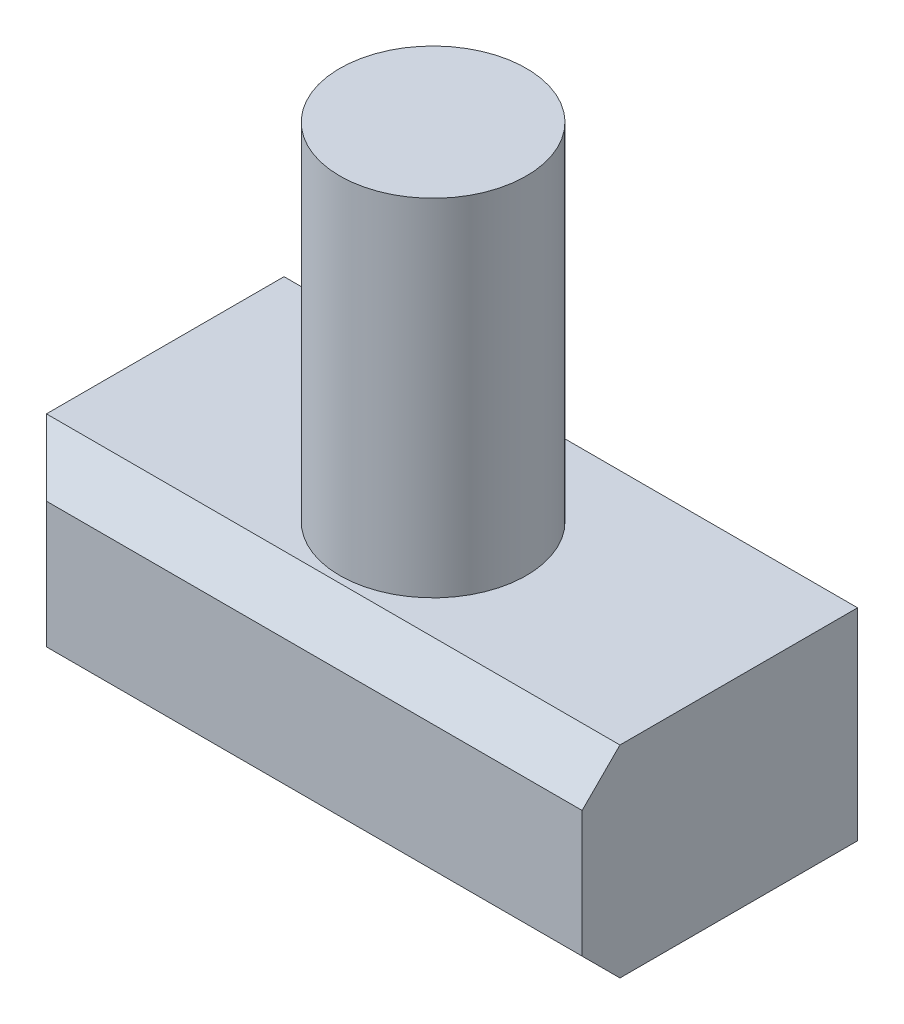
ISO-10303-21;
HEADER;
FILE_DESCRIPTION(('STEP AP214'),'2;1');
FILE_NAME('part.step','',(''),(''),'','','');
FILE_SCHEMA(('AUTOMOTIVE_DESIGN { 1 0 10303 214 1 1 1 1 }'));
ENDSEC;
DATA;
#1=APPLICATION_CONTEXT('core data for automotive mechanical design processes');
#2=APPLICATION_PROTOCOL_DEFINITION('international standard','automotive_design',2000,#1);
#3=PRODUCT_CONTEXT('',#1,'mechanical');
#4=PRODUCT('Part','Part','',(#3));
#5=PRODUCT_RELATED_PRODUCT_CATEGORY('part','',(#4));
#6=PRODUCT_DEFINITION_FORMATION('','',#4);
#7=PRODUCT_DEFINITION_CONTEXT('part definition',#1,'design');
#8=PRODUCT_DEFINITION('design','',#6,#7);
#9=PRODUCT_DEFINITION_SHAPE('','',#8);
#10=(LENGTH_UNIT() NAMED_UNIT(*) SI_UNIT(.MILLI.,.METRE.));
#11=(NAMED_UNIT(*) PLANE_ANGLE_UNIT() SI_UNIT($,.RADIAN.));
#12=(NAMED_UNIT(*) SI_UNIT($,.STERADIAN.) SOLID_ANGLE_UNIT());
#13=UNCERTAINTY_MEASURE_WITH_UNIT(LENGTH_MEASURE(1.E-05),#10,'distance_accuracy_value','');
#14=(GEOMETRIC_REPRESENTATION_CONTEXT(3) GLOBAL_UNCERTAINTY_ASSIGNED_CONTEXT((#13)) GLOBAL_UNIT_ASSIGNED_CONTEXT((#10,
#11,#12)) REPRESENTATION_CONTEXT('',''));
#15=CARTESIAN_POINT('',(0.,0.,0.));
#16=DIRECTION('',(0.,0.,1.));
#17=DIRECTION('',(1.,0.,0.));
#18=AXIS2_PLACEMENT_3D('',#15,#16,#17);
#19=CARTESIAN_POINT('',(122.714640909491,86.36,-58.9328670629167));
#20=DIRECTION('',(-1.,0.,0.));
#21=DIRECTION('',(0.,0.,1.));
#22=AXIS2_PLACEMENT_3D('',#19,#20,#21);
#23=PLANE('',#22);
#24=DIRECTION('',(0.,0.,-1.));
#25=VECTOR('',#24,1.);
#26=CARTESIAN_POINT('',(122.714640909491,86.36,-58.9328670629167));
#27=LINE('',#26,#25);
#28=CARTESIAN_POINT('',(122.714640909491,86.36,42.7528664029167));
#29=VERTEX_POINT('',#28);
#30=CARTESIAN_POINT('',(122.714640909491,86.36,-58.9328670629167));
#31=VERTEX_POINT('',#30);
#32=EDGE_CURVE('E93',#29,#31,#27,.T.);
#33=ORIENTED_EDGE('',*,*,#32,.F.);
#34=DIRECTION('',(0.,-0.707106781186546,0.707106781186549));
#35=VECTOR('',#34,1.);
#36=CARTESIAN_POINT('',(122.714640909491,86.36,42.7528664029167));
#37=LINE('',#36,#35);
#38=CARTESIAN_POINT('',(122.714640909491,70.17999934,58.9328670629167));
#39=VERTEX_POINT('',#38);
#40=EDGE_CURVE('E124',#29,#39,#37,.T.);
#41=ORIENTED_EDGE('',*,*,#40,.T.);
#42=DIRECTION('',(0.,-1.,0.));
#43=VECTOR('',#42,1.);
#44=CARTESIAN_POINT('',(122.714640909491,86.36,58.9328670629167));
#45=LINE('',#44,#43);
#46=CARTESIAN_POINT('',(122.714640909491,16.18000066,58.9328670629167));
#47=VERTEX_POINT('',#46);
#48=EDGE_CURVE('E119',#39,#47,#45,.T.);
#49=ORIENTED_EDGE('',*,*,#48,.T.);
#50=DIRECTION('',(0.,0.707106781186546,0.707106781186549));
#51=VECTOR('',#50,1.);
#52=CARTESIAN_POINT('',(122.714640909491,16.18000066,58.9328670629167));
#53=LINE('',#52,#51);
#54=CARTESIAN_POINT('',(122.714640909491,0.,42.7528664029167));
#55=VERTEX_POINT('',#54);
#56=EDGE_CURVE('E117',#47,#55,#53,.F.);
#57=ORIENTED_EDGE('',*,*,#56,.T.);
#58=DIRECTION('',(0.,0.,-1.));
#59=VECTOR('',#58,1.);
#60=CARTESIAN_POINT('',(122.714640909491,0.,-58.9328670629167));
#61=LINE('',#60,#59);
#62=CARTESIAN_POINT('',(122.714640909491,0.,-58.9328670629167));
#63=VERTEX_POINT('',#62);
#64=EDGE_CURVE('E114',#55,#63,#61,.T.);
#65=ORIENTED_EDGE('',*,*,#64,.T.);
#66=DIRECTION('',(0.,-1.,0.));
#67=VECTOR('',#66,1.);
#68=CARTESIAN_POINT('',(122.714640909491,86.36,-58.9328670629167));
#69=LINE('',#68,#67);
#70=EDGE_CURVE('E108',#31,#63,#69,.T.);
#71=ORIENTED_EDGE('',*,*,#70,.F.);
#72=EDGE_LOOP('',(#33,#41,#49,#57,#65,#71));
#73=FACE_BOUND('',#72,.T.);
#74=ADVANCED_FACE('F35',(#73),#23,.F.);
#75=CARTESIAN_POINT('',(-122.714640909491,86.36,-58.9328670629167));
#76=DIRECTION('',(0.,0.,1.));
#77=DIRECTION('',(1.,0.,0.));
#78=AXIS2_PLACEMENT_3D('',#75,#76,#77);
#79=PLANE('',#78);
#80=DIRECTION('',(-1.,0.,0.));
#81=VECTOR('',#80,1.);
#82=CARTESIAN_POINT('',(-122.714640909491,0.,-58.9328670629167));
#83=LINE('',#82,#81);
#84=CARTESIAN_POINT('',(-122.714640909491,0.,-58.9328670629167));
#85=VERTEX_POINT('',#84);
#86=EDGE_CURVE('E146',#63,#85,#83,.T.);
#87=ORIENTED_EDGE('',*,*,#86,.T.);
#88=DIRECTION('',(0.,-1.,0.));
#89=VECTOR('',#88,1.);
#90=CARTESIAN_POINT('',(-122.714640909491,86.36,-58.9328670629167));
#91=LINE('',#90,#89);
#92=CARTESIAN_POINT('',(-122.714640909491,86.36,-58.9328670629167));
#93=VERTEX_POINT('',#92);
#94=EDGE_CURVE('E110',#93,#85,#91,.T.);
#95=ORIENTED_EDGE('',*,*,#94,.F.);
#96=DIRECTION('',(-1.,0.,0.));
#97=VECTOR('',#96,1.);
#98=CARTESIAN_POINT('',(-122.714640909491,86.36,-58.9328670629167));
#99=LINE('',#98,#97);
#100=EDGE_CURVE('E97',#31,#93,#99,.T.);
#101=ORIENTED_EDGE('',*,*,#100,.F.);
#102=ORIENTED_EDGE('',*,*,#70,.T.);
#103=EDGE_LOOP('',(#87,#95,#101,#102));
#104=FACE_BOUND('',#103,.T.);
#105=ADVANCED_FACE('F107',(#104),#79,.F.);
#106=CARTESIAN_POINT('',(-122.714640909491,86.36,-58.9328670629167));
#107=DIRECTION('',(1.,0.,0.));
#108=DIRECTION('',(0.,0.,-1.));
#109=AXIS2_PLACEMENT_3D('',#106,#107,#108);
#110=PLANE('',#109);
#111=DIRECTION('',(0.,0.,1.));
#112=VECTOR('',#111,1.);
#113=CARTESIAN_POINT('',(-122.714640909491,0.,-58.9328670629167));
#114=LINE('',#113,#112);
#115=CARTESIAN_POINT('',(-122.714640909491,0.,42.7528664029167));
#116=VERTEX_POINT('',#115);
#117=EDGE_CURVE('E103',#85,#116,#114,.T.);
#118=ORIENTED_EDGE('',*,*,#117,.T.);
#119=DIRECTION('',(0.,1.,0.));
#120=VECTOR('',#119,1.);
#121=CARTESIAN_POINT('',(-122.714640909491,86.36,42.7528664029167));
#122=LINE('',#121,#120);
#123=CARTESIAN_POINT('',(-122.714640909491,86.36,42.7528664029167));
#124=VERTEX_POINT('',#123);
#125=EDGE_CURVE('E131',#116,#124,#122,.T.);
#126=ORIENTED_EDGE('',*,*,#125,.T.);
#127=DIRECTION('',(0.,0.,1.));
#128=VECTOR('',#127,1.);
#129=CARTESIAN_POINT('',(-122.714640909491,86.36,-58.9328670629167));
#130=LINE('',#129,#128);
#131=EDGE_CURVE('E112',#93,#124,#130,.T.);
#132=ORIENTED_EDGE('',*,*,#131,.F.);
#133=ORIENTED_EDGE('',*,*,#94,.T.);
#134=EDGE_LOOP('',(#118,#126,#132,#133));
#135=FACE_BOUND('',#134,.T.);
#136=ADVANCED_FACE('F157',(#135),#110,.F.);
#137=CARTESIAN_POINT('',(-122.714640909491,86.36,58.9328670629167));
#138=DIRECTION('',(0.,0.,-1.));
#139=DIRECTION('',(-1.,0.,0.));
#140=AXIS2_PLACEMENT_3D('',#137,#138,#139);
#141=PLANE('',#140);
#142=ORIENTED_EDGE('',*,*,#48,.F.);
#143=DIRECTION('',(-1.,0.,0.));
#144=VECTOR('',#143,1.);
#145=CARTESIAN_POINT('',(-122.714640909491,70.17999934,58.9328670629167));
#146=LINE('',#145,#144);
#147=CARTESIAN_POINT('',(-106.534640249491,70.17999934,58.9328670629167));
#148=VERTEX_POINT('',#147);
#149=EDGE_CURVE('E60',#39,#148,#146,.T.);
#150=ORIENTED_EDGE('',*,*,#149,.T.);
#151=DIRECTION('',(0.,-1.,0.));
#152=VECTOR('',#151,1.);
#153=CARTESIAN_POINT('',(-106.534640249491,86.36,58.9328670629167));
#154=LINE('',#153,#152);
#155=CARTESIAN_POINT('',(-106.534640249491,16.18000066,58.9328670629167));
#156=VERTEX_POINT('',#155);
#157=EDGE_CURVE('E128',#148,#156,#154,.T.);
#158=ORIENTED_EDGE('',*,*,#157,.T.);
#159=DIRECTION('',(1.,0.,0.));
#160=VECTOR('',#159,1.);
#161=CARTESIAN_POINT('',(-122.714640909491,16.18000066,58.9328670629167));
#162=LINE('',#161,#160);
#163=EDGE_CURVE('E126',#156,#47,#162,.T.);
#164=ORIENTED_EDGE('',*,*,#163,.T.);
#165=EDGE_LOOP('',(#142,#150,#158,#164));
#166=FACE_BOUND('',#165,.T.);
#167=ADVANCED_FACE('F165',(#166),#141,.F.);
#168=CARTESIAN_POINT('',(0.,86.36,0.));
#169=DIRECTION('',(0.,1.,0.));
#170=DIRECTION('',(0.,0.,1.));
#171=AXIS2_PLACEMENT_3D('',#168,#169,#170);
#172=PLANE('',#171);
#173=CARTESIAN_POINT('',(0.,86.36,0.));
#174=DIRECTION('',(0.,1.,0.));
#175=DIRECTION('',(0.,0.,1.));
#176=AXIS2_PLACEMENT_3D('',#173,#174,#175);
#177=CIRCLE('',#176,39.9157816817868);
#178=CARTESIAN_POINT('',(0.,86.36,39.9157816817868));
#179=VERTEX_POINT('',#178);
#180=EDGE_CURVE('E11',#179,#179,#177,.T.);
#181=ORIENTED_EDGE('',*,*,#180,.F.);
#182=EDGE_LOOP('',(#181));
#183=FACE_BOUND('',#182,.T.);
#184=ORIENTED_EDGE('',*,*,#131,.T.);
#185=DIRECTION('',(1.,0.,0.));
#186=VECTOR('',#185,1.);
#187=CARTESIAN_POINT('',(122.714640909491,86.36,42.7528664029167));
#188=LINE('',#187,#186);
#189=EDGE_CURVE('E100',#124,#29,#188,.T.);
#190=ORIENTED_EDGE('',*,*,#189,.T.);
#191=ORIENTED_EDGE('',*,*,#32,.T.);
#192=ORIENTED_EDGE('',*,*,#100,.T.);
#193=EDGE_LOOP('',(#184,#190,#191,#192));
#194=FACE_BOUND('',#193,.T.);
#195=ADVANCED_FACE('F96',(#183,#194),#172,.T.);
#196=CARTESIAN_POINT('',(0.,0.,0.));
#197=DIRECTION('',(0.,1.,0.));
#198=DIRECTION('',(0.,0.,1.));
#199=AXIS2_PLACEMENT_3D('',#196,#197,#198);
#200=PLANE('',#199);
#201=ORIENTED_EDGE('',*,*,#64,.F.);
#202=DIRECTION('',(-1.,0.,0.));
#203=VECTOR('',#202,1.);
#204=CARTESIAN_POINT('',(0.,0.,42.7528664029167));
#205=LINE('',#204,#203);
#206=EDGE_CURVE('E45',#55,#116,#205,.T.);
#207=ORIENTED_EDGE('',*,*,#206,.T.);
#208=ORIENTED_EDGE('',*,*,#117,.F.);
#209=ORIENTED_EDGE('',*,*,#86,.F.);
#210=EDGE_LOOP('',(#201,#207,#208,#209));
#211=FACE_BOUND('',#210,.T.);
#212=ADVANCED_FACE('F158',(#211),#200,.F.);
#213=CARTESIAN_POINT('',(-122.714640909491,16.18000066,58.9328670629167));
#214=DIRECTION('',(0.,0.707106781186549,-0.707106781186546));
#215=DIRECTION('',(1.,0.,0.));
#216=AXIS2_PLACEMENT_3D('',#213,#214,#215);
#217=PLANE('',#216);
#218=ORIENTED_EDGE('',*,*,#56,.F.);
#219=ORIENTED_EDGE('',*,*,#163,.F.);
#220=DIRECTION('',(-0.577350269189625,-0.577350269189625,-0.577350269189628));
#221=VECTOR('',#220,1.);
#222=CARTESIAN_POINT('',(-111.927973802825,10.7866671066667,53.5395335095834));
#223=LINE('',#222,#221);
#224=EDGE_CURVE('E40',#116,#156,#223,.F.);
#225=ORIENTED_EDGE('',*,*,#224,.F.);
#226=ORIENTED_EDGE('',*,*,#206,.F.);
#227=EDGE_LOOP('',(#218,#219,#225,#226));
#228=FACE_BOUND('',#227,.T.);
#229=ADVANCED_FACE('F38',(#228),#217,.F.);
#230=CARTESIAN_POINT('',(-106.534640249491,86.36,58.9328670629167));
#231=DIRECTION('',(0.707106781186549,0.,-0.707106781186546));
#232=DIRECTION('',(0.,-1.,0.));
#233=AXIS2_PLACEMENT_3D('',#230,#231,#232);
#234=PLANE('',#233);
#235=ORIENTED_EDGE('',*,*,#224,.T.);
#236=ORIENTED_EDGE('',*,*,#157,.F.);
#237=DIRECTION('',(0.577350269189625,-0.577350269189625,0.577350269189628));
#238=VECTOR('',#237,1.);
#239=CARTESIAN_POINT('',(-111.927973802825,75.5733328933333,53.5395335095834));
#240=LINE('',#239,#238);
#241=EDGE_CURVE('E133',#124,#148,#240,.T.);
#242=ORIENTED_EDGE('',*,*,#241,.F.);
#243=ORIENTED_EDGE('',*,*,#125,.F.);
#244=EDGE_LOOP('',(#235,#236,#242,#243));
#245=FACE_BOUND('',#244,.T.);
#246=ADVANCED_FACE('F155',(#245),#234,.F.);
#247=CARTESIAN_POINT('',(0.,86.36,42.7528664029167));
#248=DIRECTION('',(0.,0.707106781186549,0.707106781186546));
#249=DIRECTION('',(-1.,0.,0.));
#250=AXIS2_PLACEMENT_3D('',#247,#248,#249);
#251=PLANE('',#250);
#252=ORIENTED_EDGE('',*,*,#241,.T.);
#253=ORIENTED_EDGE('',*,*,#149,.F.);
#254=ORIENTED_EDGE('',*,*,#40,.F.);
#255=ORIENTED_EDGE('',*,*,#189,.F.);
#256=EDGE_LOOP('',(#252,#253,#254,#255));
#257=FACE_BOUND('',#256,.T.);
#258=ADVANCED_FACE('F178',(#257),#251,.T.);
#259=CARTESIAN_POINT('',(0.,234.442,0.));
#260=DIRECTION('',(0.,-1.,0.));
#261=DIRECTION('',(0.,0.,-1.));
#262=AXIS2_PLACEMENT_3D('',#259,#260,#261);
#263=CYLINDRICAL_SURFACE('',#262,39.9157816817868);
#264=CARTESIAN_POINT('',(0.,234.442,0.));
#265=DIRECTION('',(0.,1.,0.));
#266=DIRECTION('',(0.,0.,1.));
#267=AXIS2_PLACEMENT_3D('',#264,#265,#266);
#268=CIRCLE('',#267,39.9157816817868);
#269=CARTESIAN_POINT('',(0.,234.442,39.9157816817868));
#270=VERTEX_POINT('',#269);
#271=EDGE_CURVE('E135',#270,#270,#268,.T.);
#272=ORIENTED_EDGE('',*,*,#271,.F.);
#273=EDGE_LOOP('',(#272));
#274=FACE_BOUND('',#273,.T.);
#275=ORIENTED_EDGE('',*,*,#180,.T.);
#276=EDGE_LOOP('',(#275));
#277=FACE_BOUND('',#276,.T.);
#278=ADVANCED_FACE('F183',(#274,#277),#263,.T.);
#279=CARTESIAN_POINT('',(0.,234.442,0.));
#280=DIRECTION('',(0.,1.,0.));
#281=DIRECTION('',(0.,0.,1.));
#282=AXIS2_PLACEMENT_3D('',#279,#280,#281);
#283=PLANE('',#282);
#284=ORIENTED_EDGE('',*,*,#271,.T.);
#285=EDGE_LOOP('',(#284));
#286=FACE_BOUND('',#285,.T.);
#287=ADVANCED_FACE('F202',(#286),#283,.T.);
#288=CLOSED_SHELL('',(#74,#105,#136,#167,#195,#212,#229,#246,#258,#278,#287));
#289=MANIFOLD_SOLID_BREP('B2',#288);
#290=ADVANCED_BREP_SHAPE_REPRESENTATION('',(#18,#289),#14);
#291=SHAPE_DEFINITION_REPRESENTATION(#9,#290);
ENDSEC;
END-ISO-10303-21;
